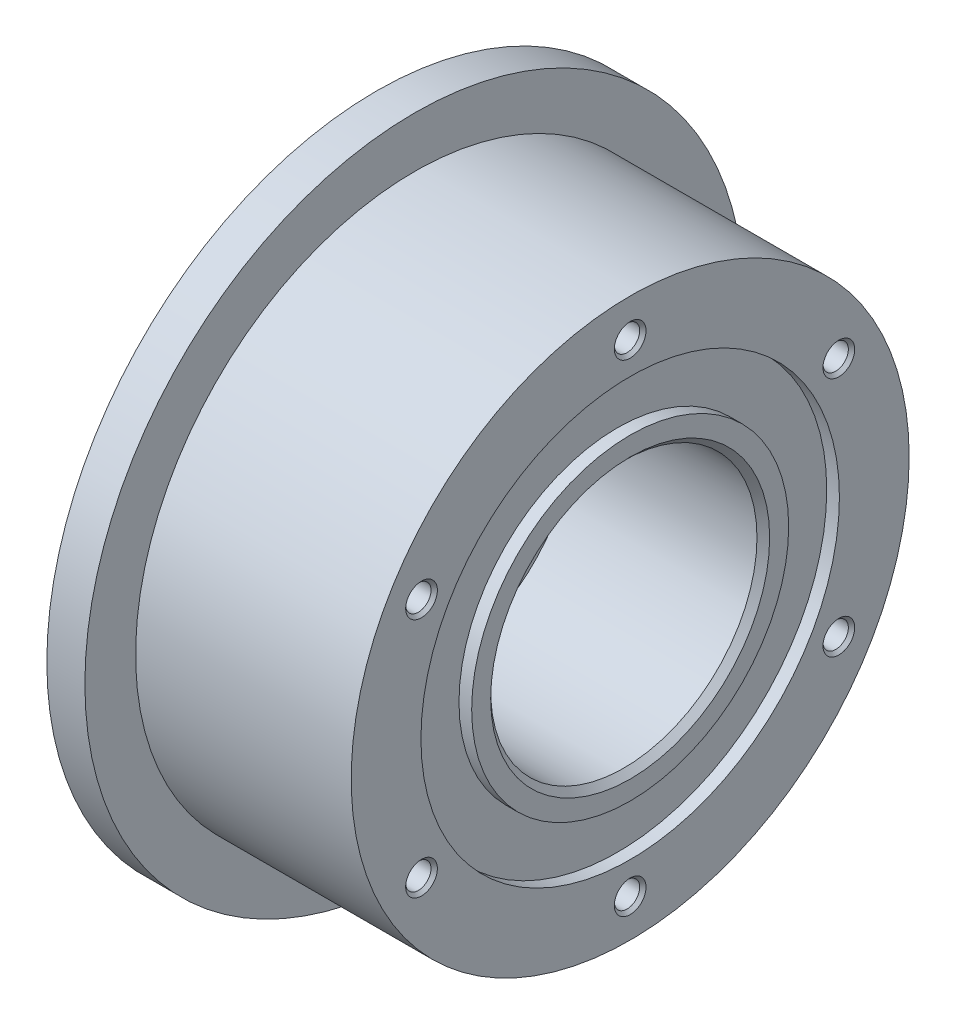
ISO-10303-21;
HEADER;
FILE_DESCRIPTION(('STEP AP214'),'2;1');
FILE_NAME('part.step','',(''),(''),'','','');
FILE_SCHEMA(('AUTOMOTIVE_DESIGN { 1 0 10303 214 1 1 1 1 }'));
ENDSEC;
DATA;
#1=APPLICATION_CONTEXT('core data for automotive mechanical design processes');
#2=APPLICATION_PROTOCOL_DEFINITION('international standard','automotive_design',2000,#1);
#3=PRODUCT_CONTEXT('',#1,'mechanical');
#4=PRODUCT('Part','Part','',(#3));
#5=PRODUCT_RELATED_PRODUCT_CATEGORY('part','',(#4));
#6=PRODUCT_DEFINITION_FORMATION('','',#4);
#7=PRODUCT_DEFINITION_CONTEXT('part definition',#1,'design');
#8=PRODUCT_DEFINITION('design','',#6,#7);
#9=PRODUCT_DEFINITION_SHAPE('','',#8);
#10=(LENGTH_UNIT() NAMED_UNIT(*) SI_UNIT(.MILLI.,.METRE.));
#11=(NAMED_UNIT(*) PLANE_ANGLE_UNIT() SI_UNIT($,.RADIAN.));
#12=(NAMED_UNIT(*) SI_UNIT($,.STERADIAN.) SOLID_ANGLE_UNIT());
#13=UNCERTAINTY_MEASURE_WITH_UNIT(LENGTH_MEASURE(1.E-05),#10,'distance_accuracy_value','');
#14=(GEOMETRIC_REPRESENTATION_CONTEXT(3) GLOBAL_UNCERTAINTY_ASSIGNED_CONTEXT((#13)) GLOBAL_UNIT_ASSIGNED_CONTEXT((#10,
#11,#12)) REPRESENTATION_CONTEXT('',''));
#15=CARTESIAN_POINT('',(0.,0.,0.));
#16=DIRECTION('',(0.,0.,1.));
#17=DIRECTION('',(1.,0.,0.));
#18=AXIS2_PLACEMENT_3D('',#15,#16,#17);
#19=CARTESIAN_POINT('',(-5.,0.,0.));
#20=DIRECTION('',(1.,0.,0.));
#21=DIRECTION('',(0.,0.,-1.));
#22=AXIS2_PLACEMENT_3D('',#19,#20,#21);
#23=CYLINDRICAL_SURFACE('',#22,31.);
#24=CARTESIAN_POINT('',(-2.,0.,0.));
#25=DIRECTION('',(1.,0.,0.));
#26=DIRECTION('',(0.,0.,-1.));
#27=AXIS2_PLACEMENT_3D('',#24,#25,#26);
#28=CIRCLE('',#27,31.);
#29=CARTESIAN_POINT('',(-2.,0.,-31.));
#30=VERTEX_POINT('',#29);
#31=EDGE_CURVE('E141',#30,#30,#28,.T.);
#32=ORIENTED_EDGE('',*,*,#31,.T.);
#33=EDGE_LOOP('',(#32));
#34=FACE_BOUND('',#33,.T.);
#35=CARTESIAN_POINT('',(15.5,0.,0.));
#36=DIRECTION('',(1.,0.,0.));
#37=DIRECTION('',(0.,0.,-1.));
#38=AXIS2_PLACEMENT_3D('',#35,#36,#37);
#39=CIRCLE('',#38,31.);
#40=CARTESIAN_POINT('',(15.5,0.,-31.));
#41=VERTEX_POINT('',#40);
#42=EDGE_CURVE('E120',#41,#41,#39,.T.);
#43=ORIENTED_EDGE('',*,*,#42,.F.);
#44=EDGE_LOOP('',(#43));
#45=FACE_BOUND('',#44,.T.);
#46=ADVANCED_FACE('F31',(#34,#45),#23,.T.);
#47=CARTESIAN_POINT('',(15.5,0.,0.));
#48=DIRECTION('',(1.,0.,0.));
#49=DIRECTION('',(0.,0.,-1.));
#50=AXIS2_PLACEMENT_3D('',#47,#48,#49);
#51=TOROIDAL_SURFACE('',#50,34.5,3.5);
#52=ORIENTED_EDGE('',*,*,#42,.T.);
#53=EDGE_LOOP('',(#52));
#54=FACE_BOUND('',#53,.T.);
#55=CARTESIAN_POINT('',(15.5,0.,0.));
#56=DIRECTION('',(1.,0.,0.));
#57=DIRECTION('',(0.,0.,-1.));
#58=AXIS2_PLACEMENT_3D('',#55,#56,#57);
#59=CIRCLE('',#58,38.);
#60=CARTESIAN_POINT('',(15.5,0.,-38.));
#61=VERTEX_POINT('',#60);
#62=EDGE_CURVE('E123',#61,#61,#59,.T.);
#63=ORIENTED_EDGE('',*,*,#62,.F.);
#64=EDGE_LOOP('',(#63));
#65=FACE_BOUND('',#64,.T.);
#66=ADVANCED_FACE('F222',(#54,#65),#51,.F.);
#67=CARTESIAN_POINT('',(-5.,0.,0.));
#68=DIRECTION('',(1.,0.,0.));
#69=DIRECTION('',(0.,0.,-1.));
#70=AXIS2_PLACEMENT_3D('',#67,#68,#69);
#71=CYLINDRICAL_SURFACE('',#70,38.);
#72=ORIENTED_EDGE('',*,*,#62,.T.);
#73=EDGE_LOOP('',(#72));
#74=FACE_BOUND('',#73,.T.);
#75=CARTESIAN_POINT('',(-5.,0.,0.));
#76=DIRECTION('',(1.,0.,0.));
#77=DIRECTION('',(0.,0.,-1.));
#78=AXIS2_PLACEMENT_3D('',#75,#76,#77);
#79=CIRCLE('',#78,38.);
#80=CARTESIAN_POINT('',(-5.,0.,-38.));
#81=VERTEX_POINT('',#80);
#82=EDGE_CURVE('E126',#81,#81,#79,.T.);
#83=ORIENTED_EDGE('',*,*,#82,.F.);
#84=EDGE_LOOP('',(#83));
#85=FACE_BOUND('',#84,.T.);
#86=ADVANCED_FACE('F228',(#74,#85),#71,.F.);
#87=CARTESIAN_POINT('',(-5.,52.,0.));
#88=DIRECTION('',(-1.,0.,0.));
#89=DIRECTION('',(0.,0.,1.));
#90=AXIS2_PLACEMENT_3D('',#87,#88,#89);
#91=PLANE('',#90);
#92=ORIENTED_EDGE('',*,*,#82,.T.);
#93=EDGE_LOOP('',(#92));
#94=FACE_BOUND('',#93,.T.);
#95=CARTESIAN_POINT('',(-5.,0.,0.));
#96=DIRECTION('',(1.,0.,0.));
#97=DIRECTION('',(0.,0.,-1.));
#98=AXIS2_PLACEMENT_3D('',#95,#96,#97);
#99=CIRCLE('',#98,52.);
#100=CARTESIAN_POINT('',(-5.,0.,-52.));
#101=VERTEX_POINT('',#100);
#102=EDGE_CURVE('E129',#101,#101,#99,.T.);
#103=ORIENTED_EDGE('',*,*,#102,.F.);
#104=EDGE_LOOP('',(#103));
#105=FACE_BOUND('',#104,.T.);
#106=ADVANCED_FACE('F307',(#94,#105),#91,.T.);
#107=CARTESIAN_POINT('',(-5.,0.,0.));
#108=DIRECTION('',(1.,0.,0.));
#109=DIRECTION('',(0.,0.,-1.));
#110=AXIS2_PLACEMENT_3D('',#107,#108,#109);
#111=CYLINDRICAL_SURFACE('',#110,52.);
#112=ORIENTED_EDGE('',*,*,#102,.T.);
#113=EDGE_LOOP('',(#112));
#114=FACE_BOUND('',#113,.T.);
#115=CARTESIAN_POINT('',(1.,0.,0.));
#116=DIRECTION('',(1.,0.,0.));
#117=DIRECTION('',(0.,0.,-1.));
#118=AXIS2_PLACEMENT_3D('',#115,#116,#117);
#119=CIRCLE('',#118,52.);
#120=CARTESIAN_POINT('',(1.,0.,-52.));
#121=VERTEX_POINT('',#120);
#122=EDGE_CURVE('E132',#121,#121,#119,.T.);
#123=ORIENTED_EDGE('',*,*,#122,.F.);
#124=EDGE_LOOP('',(#123));
#125=FACE_BOUND('',#124,.T.);
#126=ADVANCED_FACE('F300',(#114,#125),#111,.T.);
#127=CARTESIAN_POINT('',(1.,44.,0.));
#128=DIRECTION('',(1.,0.,0.));
#129=DIRECTION('',(0.,0.,-1.));
#130=AXIS2_PLACEMENT_3D('',#127,#128,#129);
#131=PLANE('',#130);
#132=ORIENTED_EDGE('',*,*,#122,.T.);
#133=EDGE_LOOP('',(#132));
#134=FACE_BOUND('',#133,.T.);
#135=CARTESIAN_POINT('',(1.,0.,0.));
#136=DIRECTION('',(1.,0.,0.));
#137=DIRECTION('',(0.,0.,-1.));
#138=AXIS2_PLACEMENT_3D('',#135,#136,#137);
#139=CIRCLE('',#138,44.);
#140=CARTESIAN_POINT('',(1.,0.,-44.));
#141=VERTEX_POINT('',#140);
#142=EDGE_CURVE('E135',#141,#141,#139,.T.);
#143=ORIENTED_EDGE('',*,*,#142,.F.);
#144=EDGE_LOOP('',(#143));
#145=FACE_BOUND('',#144,.T.);
#146=ADVANCED_FACE('F294',(#134,#145),#131,.T.);
#147=CARTESIAN_POINT('',(-5.,0.,0.));
#148=DIRECTION('',(1.,0.,0.));
#149=DIRECTION('',(0.,0.,-1.));
#150=AXIS2_PLACEMENT_3D('',#147,#148,#149);
#151=CYLINDRICAL_SURFACE('',#150,44.);
#152=ORIENTED_EDGE('',*,*,#142,.T.);
#153=EDGE_LOOP('',(#152));
#154=FACE_BOUND('',#153,.T.);
#155=CARTESIAN_POINT('',(35.,0.,0.));
#156=DIRECTION('',(1.,0.,0.));
#157=DIRECTION('',(0.,0.,-1.));
#158=AXIS2_PLACEMENT_3D('',#155,#156,#157);
#159=CIRCLE('',#158,44.);
#160=CARTESIAN_POINT('',(35.,0.,-44.));
#161=VERTEX_POINT('',#160);
#162=EDGE_CURVE('E138',#161,#161,#159,.T.);
#163=ORIENTED_EDGE('',*,*,#162,.F.);
#164=EDGE_LOOP('',(#163));
#165=FACE_BOUND('',#164,.T.);
#166=ADVANCED_FACE('F286',(#154,#165),#151,.T.);
#167=CARTESIAN_POINT('',(35.,0.,0.));
#168=DIRECTION('',(1.,0.,0.));
#169=DIRECTION('',(0.,0.,-1.));
#170=AXIS2_PLACEMENT_3D('',#167,#168,#169);
#171=PLANE('',#170);
#172=CARTESIAN_POINT('',(35.,-19.,32.9089653438087));
#173=DIRECTION('',(1.,0.,0.));
#174=DIRECTION('',(0.,0.,-1.));
#175=AXIS2_PLACEMENT_3D('',#172,#173,#174);
#176=CIRCLE('',#175,2.50000000004499);
#177=CARTESIAN_POINT('',(35.,-19.,30.4089653437637));
#178=VERTEX_POINT('',#177);
#179=EDGE_CURVE('E90',#178,#178,#176,.F.);
#180=ORIENTED_EDGE('',*,*,#179,.T.);
#181=EDGE_LOOP('',(#180));
#182=FACE_BOUND('',#181,.T.);
#183=CARTESIAN_POINT('',(35.,-38.,0.));
#184=DIRECTION('',(1.,0.,0.));
#185=DIRECTION('',(0.,0.,-1.));
#186=AXIS2_PLACEMENT_3D('',#183,#184,#185);
#187=CIRCLE('',#186,2.50000000004504);
#188=CARTESIAN_POINT('',(35.,-38.,-2.50000000004503));
#189=VERTEX_POINT('',#188);
#190=EDGE_CURVE('E93',#189,#189,#187,.F.);
#191=ORIENTED_EDGE('',*,*,#190,.T.);
#192=EDGE_LOOP('',(#191));
#193=FACE_BOUND('',#192,.T.);
#194=CARTESIAN_POINT('',(35.,19.,-32.9089653438087));
#195=DIRECTION('',(1.,0.,0.));
#196=DIRECTION('',(0.,0.,-1.));
#197=AXIS2_PLACEMENT_3D('',#194,#195,#196);
#198=CIRCLE('',#197,2.50000000004504);
#199=CARTESIAN_POINT('',(35.,19.,-35.4089653438537));
#200=VERTEX_POINT('',#199);
#201=EDGE_CURVE('E96',#200,#200,#198,.F.);
#202=ORIENTED_EDGE('',*,*,#201,.T.);
#203=EDGE_LOOP('',(#202));
#204=FACE_BOUND('',#203,.T.);
#205=CARTESIAN_POINT('',(35.,38.,0.));
#206=DIRECTION('',(1.,0.,0.));
#207=DIRECTION('',(0.,0.,-1.));
#208=AXIS2_PLACEMENT_3D('',#205,#206,#207);
#209=CIRCLE('',#208,2.50000000004504);
#210=CARTESIAN_POINT('',(35.,38.,-2.50000000004504));
#211=VERTEX_POINT('',#210);
#212=EDGE_CURVE('E99',#211,#211,#209,.F.);
#213=ORIENTED_EDGE('',*,*,#212,.T.);
#214=EDGE_LOOP('',(#213));
#215=FACE_BOUND('',#214,.T.);
#216=CARTESIAN_POINT('',(35.,-19.,-32.9089653438087));
#217=DIRECTION('',(1.,0.,0.));
#218=DIRECTION('',(0.,0.,-1.));
#219=AXIS2_PLACEMENT_3D('',#216,#217,#218);
#220=CIRCLE('',#219,2.50000000004504);
#221=CARTESIAN_POINT('',(35.,-19.,-35.4089653438537));
#222=VERTEX_POINT('',#221);
#223=EDGE_CURVE('E102',#222,#222,#220,.F.);
#224=ORIENTED_EDGE('',*,*,#223,.T.);
#225=EDGE_LOOP('',(#224));
#226=FACE_BOUND('',#225,.T.);
#227=CARTESIAN_POINT('',(35.,19.,32.9089653438087));
#228=DIRECTION('',(1.,0.,0.));
#229=DIRECTION('',(0.,0.,-1.));
#230=AXIS2_PLACEMENT_3D('',#227,#228,#229);
#231=CIRCLE('',#230,2.50000000004499);
#232=CARTESIAN_POINT('',(35.,19.,30.4089653437637));
#233=VERTEX_POINT('',#232);
#234=EDGE_CURVE('E105',#233,#233,#231,.F.);
#235=ORIENTED_EDGE('',*,*,#234,.T.);
#236=EDGE_LOOP('',(#235));
#237=FACE_BOUND('',#236,.T.);
#238=CARTESIAN_POINT('',(35.,0.,0.));
#239=DIRECTION('',(1.,0.,0.));
#240=DIRECTION('',(0.,0.,-1.));
#241=AXIS2_PLACEMENT_3D('',#238,#239,#240);
#242=CIRCLE('',#241,33.);
#243=CARTESIAN_POINT('',(35.,0.,-33.));
#244=VERTEX_POINT('',#243);
#245=EDGE_CURVE('E147',#244,#244,#242,.T.);
#246=ORIENTED_EDGE('',*,*,#245,.F.);
#247=EDGE_LOOP('',(#246));
#248=FACE_BOUND('',#247,.T.);
#249=ORIENTED_EDGE('',*,*,#162,.T.);
#250=EDGE_LOOP('',(#249));
#251=FACE_BOUND('',#250,.T.);
#252=ADVANCED_FACE('F282',(#182,#193,#204,#215,#226,#237,#248,#251),#171,.T.);
#253=CARTESIAN_POINT('',(-2.,31.,0.));
#254=DIRECTION('',(-1.,0.,0.));
#255=DIRECTION('',(0.,0.,1.));
#256=AXIS2_PLACEMENT_3D('',#253,#254,#255);
#257=PLANE('',#256);
#258=CARTESIAN_POINT('',(-2.,0.,0.));
#259=DIRECTION('',(1.,0.,0.));
#260=DIRECTION('',(0.,0.,-1.));
#261=AXIS2_PLACEMENT_3D('',#258,#259,#260);
#262=CIRCLE('',#261,29.);
#263=CARTESIAN_POINT('',(-2.,0.,-29.));
#264=VERTEX_POINT('',#263);
#265=EDGE_CURVE('E153',#264,#264,#262,.T.);
#266=ORIENTED_EDGE('',*,*,#265,.T.);
#267=EDGE_LOOP('',(#266));
#268=FACE_BOUND('',#267,.T.);
#269=ORIENTED_EDGE('',*,*,#31,.F.);
#270=EDGE_LOOP('',(#269));
#271=FACE_BOUND('',#270,.T.);
#272=ADVANCED_FACE('F285',(#268,#271),#257,.T.);
#273=CARTESIAN_POINT('',(33.0000000000001,0.,0.));
#274=DIRECTION('',(-1.,0.,0.));
#275=DIRECTION('',(0.,0.,1.));
#276=AXIS2_PLACEMENT_3D('',#273,#274,#275);
#277=PLANE('',#276);
#278=CARTESIAN_POINT('',(33.0000000000001,0.,0.));
#279=DIRECTION('',(-1.,0.,0.));
#280=DIRECTION('',(0.,0.,1.));
#281=AXIS2_PLACEMENT_3D('',#278,#279,#280);
#282=CIRCLE('',#281,25.);
#283=CARTESIAN_POINT('',(33.0000000000001,0.,25.));
#284=VERTEX_POINT('',#283);
#285=EDGE_CURVE('E117',#284,#284,#282,.F.);
#286=ORIENTED_EDGE('',*,*,#285,.F.);
#287=EDGE_LOOP('',(#286));
#288=FACE_BOUND('',#287,.T.);
#289=CARTESIAN_POINT('',(33.,0.,0.));
#290=DIRECTION('',(1.,0.,0.));
#291=DIRECTION('',(0.,0.,-1.));
#292=AXIS2_PLACEMENT_3D('',#289,#290,#291);
#293=CIRCLE('',#292,33.);
#294=CARTESIAN_POINT('',(33.,0.,-33.));
#295=VERTEX_POINT('',#294);
#296=EDGE_CURVE('E144',#295,#295,#293,.T.);
#297=ORIENTED_EDGE('',*,*,#296,.T.);
#298=EDGE_LOOP('',(#297));
#299=FACE_BOUND('',#298,.T.);
#300=ADVANCED_FACE('F355',(#288,#299),#277,.F.);
#301=CARTESIAN_POINT('',(35.,0.,0.));
#302=DIRECTION('',(1.,0.,0.));
#303=DIRECTION('',(0.,0.,-1.));
#304=AXIS2_PLACEMENT_3D('',#301,#302,#303);
#305=CYLINDRICAL_SURFACE('',#304,33.);
#306=ORIENTED_EDGE('',*,*,#296,.F.);
#307=EDGE_LOOP('',(#306));
#308=FACE_BOUND('',#307,.T.);
#309=ORIENTED_EDGE('',*,*,#245,.T.);
#310=EDGE_LOOP('',(#309));
#311=FACE_BOUND('',#310,.T.);
#312=ADVANCED_FACE('F349',(#308,#311),#305,.F.);
#313=CARTESIAN_POINT('',(35.0000000000001,0.,0.));
#314=DIRECTION('',(-1.,0.,0.));
#315=DIRECTION('',(0.,0.,1.));
#316=AXIS2_PLACEMENT_3D('',#313,#314,#315);
#317=CYLINDRICAL_SURFACE('',#316,25.);
#318=CARTESIAN_POINT('',(35.0000000000001,0.,0.));
#319=DIRECTION('',(1.,0.,0.));
#320=DIRECTION('',(0.,0.,-1.));
#321=AXIS2_PLACEMENT_3D('',#318,#319,#320);
#322=CIRCLE('',#321,25.);
#323=CARTESIAN_POINT('',(35.0000000000001,0.,-25.));
#324=VERTEX_POINT('',#323);
#325=EDGE_CURVE('E150',#324,#324,#322,.T.);
#326=ORIENTED_EDGE('',*,*,#325,.F.);
#327=EDGE_LOOP('',(#326));
#328=FACE_BOUND('',#327,.T.);
#329=ORIENTED_EDGE('',*,*,#285,.T.);
#330=EDGE_LOOP('',(#329));
#331=FACE_BOUND('',#330,.T.);
#332=ADVANCED_FACE('F354',(#328,#331),#317,.T.);
#333=CARTESIAN_POINT('',(35.0000000000001,0.,0.));
#334=DIRECTION('',(1.,0.,0.));
#335=DIRECTION('',(0.,0.,-1.));
#336=AXIS2_PLACEMENT_3D('',#333,#334,#335);
#337=PLANE('',#336);
#338=CARTESIAN_POINT('',(35.0000000000001,0.,0.));
#339=DIRECTION('',(1.,0.,0.));
#340=DIRECTION('',(0.,0.,-1.));
#341=AXIS2_PLACEMENT_3D('',#338,#339,#340);
#342=CIRCLE('',#341,22.);
#343=CARTESIAN_POINT('',(35.0000000000001,0.,-22.));
#344=VERTEX_POINT('',#343);
#345=EDGE_CURVE('E111',#344,#344,#342,.F.);
#346=ORIENTED_EDGE('',*,*,#345,.T.);
#347=EDGE_LOOP('',(#346));
#348=FACE_BOUND('',#347,.T.);
#349=ORIENTED_EDGE('',*,*,#325,.T.);
#350=EDGE_LOOP('',(#349));
#351=FACE_BOUND('',#350,.T.);
#352=ADVANCED_FACE('F376',(#348,#351),#337,.T.);
#353=CARTESIAN_POINT('',(-2.,0.,0.));
#354=DIRECTION('',(1.,0.,0.));
#355=DIRECTION('',(0.,0.,-1.));
#356=AXIS2_PLACEMENT_3D('',#353,#354,#355);
#357=CYLINDRICAL_SURFACE('',#356,29.);
#358=ORIENTED_EDGE('',*,*,#265,.F.);
#359=EDGE_LOOP('',(#358));
#360=FACE_BOUND('',#359,.T.);
#361=CARTESIAN_POINT('',(0.,0.,0.));
#362=DIRECTION('',(1.,0.,0.));
#363=DIRECTION('',(0.,0.,-1.));
#364=AXIS2_PLACEMENT_3D('',#361,#362,#363);
#365=CIRCLE('',#364,29.);
#366=CARTESIAN_POINT('',(0.,0.,-29.));
#367=VERTEX_POINT('',#366);
#368=EDGE_CURVE('E165',#367,#367,#365,.T.);
#369=ORIENTED_EDGE('',*,*,#368,.T.);
#370=EDGE_LOOP('',(#369));
#371=FACE_BOUND('',#370,.T.);
#372=ADVANCED_FACE('F390',(#360,#371),#357,.F.);
#373=CARTESIAN_POINT('',(-2.,0.,0.));
#374=DIRECTION('',(1.,0.,0.));
#375=DIRECTION('',(0.,0.,-1.));
#376=AXIS2_PLACEMENT_3D('',#373,#374,#375);
#377=CYLINDRICAL_SURFACE('',#376,21.);
#378=CARTESIAN_POINT('',(34.,0.,0.));
#379=DIRECTION('',(1.,0.,0.));
#380=DIRECTION('',(0.,0.,-1.));
#381=AXIS2_PLACEMENT_3D('',#378,#379,#380);
#382=CIRCLE('',#381,21.);
#383=CARTESIAN_POINT('',(34.,0.,-21.));
#384=VERTEX_POINT('',#383);
#385=EDGE_CURVE('E114',#384,#384,#382,.T.);
#386=ORIENTED_EDGE('',*,*,#385,.T.);
#387=EDGE_LOOP('',(#386));
#388=FACE_BOUND('',#387,.T.);
#389=CARTESIAN_POINT('',(5.,0.,0.));
#390=DIRECTION('',(1.,0.,0.));
#391=DIRECTION('',(0.,0.,-1.));
#392=AXIS2_PLACEMENT_3D('',#389,#390,#391);
#393=CIRCLE('',#392,21.);
#394=CARTESIAN_POINT('',(5.,0.,-21.));
#395=VERTEX_POINT('',#394);
#396=EDGE_CURVE('E156',#395,#395,#393,.T.);
#397=ORIENTED_EDGE('',*,*,#396,.F.);
#398=EDGE_LOOP('',(#397));
#399=FACE_BOUND('',#398,.T.);
#400=ADVANCED_FACE('F395',(#388,#399),#377,.F.);
#401=CARTESIAN_POINT('',(5.,21.,0.));
#402=DIRECTION('',(-1.,0.,0.));
#403=DIRECTION('',(0.,0.,1.));
#404=AXIS2_PLACEMENT_3D('',#401,#402,#403);
#405=PLANE('',#404);
#406=CARTESIAN_POINT('',(5.,0.,0.));
#407=DIRECTION('',(1.,0.,0.));
#408=DIRECTION('',(0.,0.,-1.));
#409=AXIS2_PLACEMENT_3D('',#406,#407,#408);
#410=CIRCLE('',#409,17.9999999999999);
#411=CARTESIAN_POINT('',(5.,0.,-17.9999999999999));
#412=VERTEX_POINT('',#411);
#413=EDGE_CURVE('E159',#412,#412,#410,.T.);
#414=ORIENTED_EDGE('',*,*,#413,.F.);
#415=EDGE_LOOP('',(#414));
#416=FACE_BOUND('',#415,.T.);
#417=ORIENTED_EDGE('',*,*,#396,.T.);
#418=EDGE_LOOP('',(#417));
#419=FACE_BOUND('',#418,.T.);
#420=ADVANCED_FACE('F403',(#416,#419),#405,.F.);
#421=CARTESIAN_POINT('',(-2.,0.,0.));
#422=DIRECTION('',(1.,0.,0.));
#423=DIRECTION('',(0.,0.,-1.));
#424=AXIS2_PLACEMENT_3D('',#421,#422,#423);
#425=CYLINDRICAL_SURFACE('',#424,17.9999999999999);
#426=CARTESIAN_POINT('',(0.,0.,0.));
#427=DIRECTION('',(1.,0.,0.));
#428=DIRECTION('',(0.,0.,-1.));
#429=AXIS2_PLACEMENT_3D('',#426,#427,#428);
#430=CIRCLE('',#429,17.9999999999999);
#431=CARTESIAN_POINT('',(0.,0.,-17.9999999999999));
#432=VERTEX_POINT('',#431);
#433=EDGE_CURVE('E162',#432,#432,#430,.T.);
#434=ORIENTED_EDGE('',*,*,#433,.F.);
#435=EDGE_LOOP('',(#434));
#436=FACE_BOUND('',#435,.T.);
#437=ORIENTED_EDGE('',*,*,#413,.T.);
#438=EDGE_LOOP('',(#437));
#439=FACE_BOUND('',#438,.T.);
#440=ADVANCED_FACE('F408',(#436,#439),#425,.F.);
#441=CARTESIAN_POINT('',(0.,17.9999999999999,0.));
#442=DIRECTION('',(1.,0.,0.));
#443=DIRECTION('',(0.,0.,-1.));
#444=AXIS2_PLACEMENT_3D('',#441,#442,#443);
#445=PLANE('',#444);
#446=CARTESIAN_POINT('',(0.,12.,-20.7846096908265));
#447=DIRECTION('',(1.,0.,0.));
#448=DIRECTION('',(0.,0.,-1.));
#449=AXIS2_PLACEMENT_3D('',#446,#447,#448);
#450=CIRCLE('',#449,2.50000000004504);
#451=CARTESIAN_POINT('',(0.,12.,-23.2846096908715));
#452=VERTEX_POINT('',#451);
#453=EDGE_CURVE('E63',#452,#452,#450,.T.);
#454=ORIENTED_EDGE('',*,*,#453,.T.);
#455=EDGE_LOOP('',(#454));
#456=FACE_BOUND('',#455,.T.);
#457=CARTESIAN_POINT('',(0.,12.,20.7846096908265));
#458=DIRECTION('',(1.,0.,0.));
#459=DIRECTION('',(0.,0.,-1.));
#460=AXIS2_PLACEMENT_3D('',#457,#458,#459);
#461=CIRCLE('',#460,2.50000000004504);
#462=CARTESIAN_POINT('',(0.,12.,18.2846096907815));
#463=VERTEX_POINT('',#462);
#464=EDGE_CURVE('E66',#463,#463,#461,.T.);
#465=ORIENTED_EDGE('',*,*,#464,.T.);
#466=EDGE_LOOP('',(#465));
#467=FACE_BOUND('',#466,.T.);
#468=CARTESIAN_POINT('',(0.,-24.,0.));
#469=DIRECTION('',(1.,0.,0.));
#470=DIRECTION('',(0.,0.,-1.));
#471=AXIS2_PLACEMENT_3D('',#468,#469,#470);
#472=CIRCLE('',#471,2.50000000004504);
#473=CARTESIAN_POINT('',(0.,-24.,-2.50000000004504));
#474=VERTEX_POINT('',#473);
#475=EDGE_CURVE('E69',#474,#474,#472,.T.);
#476=ORIENTED_EDGE('',*,*,#475,.T.);
#477=EDGE_LOOP('',(#476));
#478=FACE_BOUND('',#477,.T.);
#479=CARTESIAN_POINT('',(0.,-12.,20.7846096908265));
#480=DIRECTION('',(1.,0.,0.));
#481=DIRECTION('',(0.,0.,-1.));
#482=AXIS2_PLACEMENT_3D('',#479,#480,#481);
#483=CIRCLE('',#482,2.50000000004504);
#484=CARTESIAN_POINT('',(0.,-12.,18.2846096907815));
#485=VERTEX_POINT('',#484);
#486=EDGE_CURVE('E72',#485,#485,#483,.T.);
#487=ORIENTED_EDGE('',*,*,#486,.T.);
#488=EDGE_LOOP('',(#487));
#489=FACE_BOUND('',#488,.T.);
#490=CARTESIAN_POINT('',(0.,-12.,-20.7846096908265));
#491=DIRECTION('',(1.,0.,0.));
#492=DIRECTION('',(0.,0.,-1.));
#493=AXIS2_PLACEMENT_3D('',#490,#491,#492);
#494=CIRCLE('',#493,2.50000000004504);
#495=CARTESIAN_POINT('',(0.,-12.,-23.2846096908715));
#496=VERTEX_POINT('',#495);
#497=EDGE_CURVE('E75',#496,#496,#494,.T.);
#498=ORIENTED_EDGE('',*,*,#497,.T.);
#499=EDGE_LOOP('',(#498));
#500=FACE_BOUND('',#499,.T.);
#501=CARTESIAN_POINT('',(0.,24.,0.));
#502=DIRECTION('',(1.,0.,0.));
#503=DIRECTION('',(0.,0.,-1.));
#504=AXIS2_PLACEMENT_3D('',#501,#502,#503);
#505=CIRCLE('',#504,2.50000000004504);
#506=CARTESIAN_POINT('',(0.,24.,-2.50000000004503));
#507=VERTEX_POINT('',#506);
#508=EDGE_CURVE('E78',#507,#507,#505,.T.);
#509=ORIENTED_EDGE('',*,*,#508,.T.);
#510=EDGE_LOOP('',(#509));
#511=FACE_BOUND('',#510,.T.);
#512=ORIENTED_EDGE('',*,*,#368,.F.);
#513=EDGE_LOOP('',(#512));
#514=FACE_BOUND('',#513,.T.);
#515=ORIENTED_EDGE('',*,*,#433,.T.);
#516=EDGE_LOOP('',(#515));
#517=FACE_BOUND('',#516,.T.);
#518=ADVANCED_FACE('F418',(#456,#467,#478,#489,#500,#511,#514,#517),#445,.F.);
#519=CARTESIAN_POINT('',(25.,19.,32.9089653438087));
#520=DIRECTION('',(-1.,0.,0.));
#521=DIRECTION('',(0.,0.,1.));
#522=AXIS2_PLACEMENT_3D('',#519,#520,#521);
#523=PLANE('',#522);
#524=CARTESIAN_POINT('',(25.,19.,32.9089653438087));
#525=DIRECTION('',(1.,0.,0.));
#526=DIRECTION('',(0.,0.,-1.));
#527=AXIS2_PLACEMENT_3D('',#524,#525,#526);
#528=CIRCLE('',#527,1.99999999999999);
#529=CARTESIAN_POINT('',(25.,19.,30.9089653438087));
#530=VERTEX_POINT('',#529);
#531=EDGE_CURVE('E168',#530,#530,#528,.T.);
#532=ORIENTED_EDGE('',*,*,#531,.T.);
#533=EDGE_LOOP('',(#532));
#534=FACE_BOUND('',#533,.T.);
#535=ADVANCED_FACE('F426',(#534),#523,.F.);
#536=CARTESIAN_POINT('',(35.,19.,32.9089653438087));
#537=DIRECTION('',(1.,0.,0.));
#538=DIRECTION('',(0.,0.,-1.));
#539=AXIS2_PLACEMENT_3D('',#536,#537,#538);
#540=CYLINDRICAL_SURFACE('',#539,1.99999999999999);
#541=CARTESIAN_POINT('',(34.499999999955,19.,32.9089653438087));
#542=DIRECTION('',(1.,0.,0.));
#543=DIRECTION('',(0.,0.,-1.));
#544=AXIS2_PLACEMENT_3D('',#541,#542,#543);
#545=CIRCLE('',#544,1.99999999999999);
#546=CARTESIAN_POINT('',(34.499999999955,19.,30.9089653438087));
#547=VERTEX_POINT('',#546);
#548=EDGE_CURVE('E38',#547,#547,#545,.T.);
#549=ORIENTED_EDGE('',*,*,#548,.T.);
#550=EDGE_LOOP('',(#549));
#551=FACE_BOUND('',#550,.T.);
#552=ORIENTED_EDGE('',*,*,#531,.F.);
#553=EDGE_LOOP('',(#552));
#554=FACE_BOUND('',#553,.T.);
#555=ADVANCED_FACE('F431',(#551,#554),#540,.F.);
#556=CARTESIAN_POINT('',(25.,-38.,0.));
#557=DIRECTION('',(-1.,0.,0.));
#558=DIRECTION('',(0.,0.,1.));
#559=AXIS2_PLACEMENT_3D('',#556,#557,#558);
#560=PLANE('',#559);
#561=CARTESIAN_POINT('',(25.,-38.,0.));
#562=DIRECTION('',(1.,0.,0.));
#563=DIRECTION('',(0.,0.,-1.));
#564=AXIS2_PLACEMENT_3D('',#561,#562,#563);
#565=CIRCLE('',#564,1.99999999999999);
#566=CARTESIAN_POINT('',(25.,-38.,-1.99999999999999));
#567=VERTEX_POINT('',#566);
#568=EDGE_CURVE('E171',#567,#567,#565,.T.);
#569=ORIENTED_EDGE('',*,*,#568,.T.);
#570=EDGE_LOOP('',(#569));
#571=FACE_BOUND('',#570,.T.);
#572=ADVANCED_FACE('F439',(#571),#560,.F.);
#573=CARTESIAN_POINT('',(35.,-38.,0.));
#574=DIRECTION('',(1.,0.,0.));
#575=DIRECTION('',(0.,0.,-1.));
#576=AXIS2_PLACEMENT_3D('',#573,#574,#575);
#577=CYLINDRICAL_SURFACE('',#576,1.99999999999999);
#578=CARTESIAN_POINT('',(34.499999999955,-38.,0.));
#579=DIRECTION('',(1.,0.,0.));
#580=DIRECTION('',(0.,0.,-1.));
#581=AXIS2_PLACEMENT_3D('',#578,#579,#580);
#582=CIRCLE('',#581,1.99999999999999);
#583=CARTESIAN_POINT('',(34.499999999955,-38.,-1.99999999999999));
#584=VERTEX_POINT('',#583);
#585=EDGE_CURVE('E87',#584,#584,#582,.T.);
#586=ORIENTED_EDGE('',*,*,#585,.T.);
#587=EDGE_LOOP('',(#586));
#588=FACE_BOUND('',#587,.T.);
#589=ORIENTED_EDGE('',*,*,#568,.F.);
#590=EDGE_LOOP('',(#589));
#591=FACE_BOUND('',#590,.T.);
#592=ADVANCED_FACE('F444',(#588,#591),#577,.F.);
#593=CARTESIAN_POINT('',(25.,-19.,-32.9089653438087));
#594=DIRECTION('',(-1.,0.,0.));
#595=DIRECTION('',(0.,0.,1.));
#596=AXIS2_PLACEMENT_3D('',#593,#594,#595);
#597=PLANE('',#596);
#598=CARTESIAN_POINT('',(25.,-19.,-32.9089653438087));
#599=DIRECTION('',(1.,0.,0.));
#600=DIRECTION('',(0.,0.,-1.));
#601=AXIS2_PLACEMENT_3D('',#598,#599,#600);
#602=CIRCLE('',#601,1.99999999999999);
#603=CARTESIAN_POINT('',(25.,-19.,-34.9089653438087));
#604=VERTEX_POINT('',#603);
#605=EDGE_CURVE('E174',#604,#604,#602,.T.);
#606=ORIENTED_EDGE('',*,*,#605,.T.);
#607=EDGE_LOOP('',(#606));
#608=FACE_BOUND('',#607,.T.);
#609=ADVANCED_FACE('F452',(#608),#597,.F.);
#610=CARTESIAN_POINT('',(35.,-19.,-32.9089653438087));
#611=DIRECTION('',(1.,0.,0.));
#612=DIRECTION('',(0.,0.,-1.));
#613=AXIS2_PLACEMENT_3D('',#610,#611,#612);
#614=CYLINDRICAL_SURFACE('',#613,1.99999999999999);
#615=CARTESIAN_POINT('',(34.499999999955,-19.,-32.9089653438087));
#616=DIRECTION('',(1.,0.,0.));
#617=DIRECTION('',(0.,0.,-1.));
#618=AXIS2_PLACEMENT_3D('',#615,#616,#617);
#619=CIRCLE('',#618,1.99999999999999);
#620=CARTESIAN_POINT('',(34.499999999955,-19.,-34.9089653438087));
#621=VERTEX_POINT('',#620);
#622=EDGE_CURVE('E46',#621,#621,#619,.T.);
#623=ORIENTED_EDGE('',*,*,#622,.T.);
#624=EDGE_LOOP('',(#623));
#625=FACE_BOUND('',#624,.T.);
#626=ORIENTED_EDGE('',*,*,#605,.F.);
#627=EDGE_LOOP('',(#626));
#628=FACE_BOUND('',#627,.T.);
#629=ADVANCED_FACE('F457',(#625,#628),#614,.F.);
#630=CARTESIAN_POINT('',(25.,19.,-32.9089653438087));
#631=DIRECTION('',(-1.,0.,0.));
#632=DIRECTION('',(0.,0.,1.));
#633=AXIS2_PLACEMENT_3D('',#630,#631,#632);
#634=PLANE('',#633);
#635=CARTESIAN_POINT('',(25.,19.,-32.9089653438087));
#636=DIRECTION('',(1.,0.,0.));
#637=DIRECTION('',(0.,0.,-1.));
#638=AXIS2_PLACEMENT_3D('',#635,#636,#637);
#639=CIRCLE('',#638,1.99999999999999);
#640=CARTESIAN_POINT('',(25.,19.,-34.9089653438087));
#641=VERTEX_POINT('',#640);
#642=EDGE_CURVE('E177',#641,#641,#639,.T.);
#643=ORIENTED_EDGE('',*,*,#642,.T.);
#644=EDGE_LOOP('',(#643));
#645=FACE_BOUND('',#644,.T.);
#646=ADVANCED_FACE('F465',(#645),#634,.F.);
#647=CARTESIAN_POINT('',(35.,19.,-32.9089653438087));
#648=DIRECTION('',(1.,0.,0.));
#649=DIRECTION('',(0.,0.,-1.));
#650=AXIS2_PLACEMENT_3D('',#647,#648,#649);
#651=CYLINDRICAL_SURFACE('',#650,1.99999999999999);
#652=CARTESIAN_POINT('',(34.499999999955,19.,-32.9089653438087));
#653=DIRECTION('',(1.,0.,0.));
#654=DIRECTION('',(0.,0.,-1.));
#655=AXIS2_PLACEMENT_3D('',#652,#653,#654);
#656=CIRCLE('',#655,1.99999999999999);
#657=CARTESIAN_POINT('',(34.499999999955,19.,-34.9089653438087));
#658=VERTEX_POINT('',#657);
#659=EDGE_CURVE('E84',#658,#658,#656,.T.);
#660=ORIENTED_EDGE('',*,*,#659,.T.);
#661=EDGE_LOOP('',(#660));
#662=FACE_BOUND('',#661,.T.);
#663=ORIENTED_EDGE('',*,*,#642,.F.);
#664=EDGE_LOOP('',(#663));
#665=FACE_BOUND('',#664,.T.);
#666=ADVANCED_FACE('F470',(#662,#665),#651,.F.);
#667=CARTESIAN_POINT('',(25.,38.,0.));
#668=DIRECTION('',(-1.,0.,0.));
#669=DIRECTION('',(0.,0.,1.));
#670=AXIS2_PLACEMENT_3D('',#667,#668,#669);
#671=PLANE('',#670);
#672=CARTESIAN_POINT('',(25.,38.,0.));
#673=DIRECTION('',(1.,0.,0.));
#674=DIRECTION('',(0.,0.,-1.));
#675=AXIS2_PLACEMENT_3D('',#672,#673,#674);
#676=CIRCLE('',#675,1.99999999999999);
#677=CARTESIAN_POINT('',(25.,38.,-1.99999999999999));
#678=VERTEX_POINT('',#677);
#679=EDGE_CURVE('E180',#678,#678,#676,.T.);
#680=ORIENTED_EDGE('',*,*,#679,.T.);
#681=EDGE_LOOP('',(#680));
#682=FACE_BOUND('',#681,.T.);
#683=ADVANCED_FACE('F478',(#682),#671,.F.);
#684=CARTESIAN_POINT('',(35.,38.,0.));
#685=DIRECTION('',(1.,0.,0.));
#686=DIRECTION('',(0.,0.,-1.));
#687=AXIS2_PLACEMENT_3D('',#684,#685,#686);
#688=CYLINDRICAL_SURFACE('',#687,1.99999999999999);
#689=CARTESIAN_POINT('',(34.499999999955,38.,0.));
#690=DIRECTION('',(1.,0.,0.));
#691=DIRECTION('',(0.,0.,-1.));
#692=AXIS2_PLACEMENT_3D('',#689,#690,#691);
#693=CIRCLE('',#692,1.99999999999999);
#694=CARTESIAN_POINT('',(34.499999999955,38.,-2.));
#695=VERTEX_POINT('',#694);
#696=EDGE_CURVE('E54',#695,#695,#693,.T.);
#697=ORIENTED_EDGE('',*,*,#696,.T.);
#698=EDGE_LOOP('',(#697));
#699=FACE_BOUND('',#698,.T.);
#700=ORIENTED_EDGE('',*,*,#679,.F.);
#701=EDGE_LOOP('',(#700));
#702=FACE_BOUND('',#701,.T.);
#703=ADVANCED_FACE('F483',(#699,#702),#688,.F.);
#704=CARTESIAN_POINT('',(25.,-19.,32.9089653438087));
#705=DIRECTION('',(-1.,0.,0.));
#706=DIRECTION('',(0.,0.,1.));
#707=AXIS2_PLACEMENT_3D('',#704,#705,#706);
#708=PLANE('',#707);
#709=CARTESIAN_POINT('',(25.,-19.,32.9089653438087));
#710=DIRECTION('',(1.,0.,0.));
#711=DIRECTION('',(0.,0.,-1.));
#712=AXIS2_PLACEMENT_3D('',#709,#710,#711);
#713=CIRCLE('',#712,1.99999999999999);
#714=CARTESIAN_POINT('',(25.,-19.,30.9089653438087));
#715=VERTEX_POINT('',#714);
#716=EDGE_CURVE('E183',#715,#715,#713,.T.);
#717=ORIENTED_EDGE('',*,*,#716,.T.);
#718=EDGE_LOOP('',(#717));
#719=FACE_BOUND('',#718,.T.);
#720=ADVANCED_FACE('F491',(#719),#708,.F.);
#721=CARTESIAN_POINT('',(35.,-19.,32.9089653438087));
#722=DIRECTION('',(1.,0.,0.));
#723=DIRECTION('',(0.,0.,-1.));
#724=AXIS2_PLACEMENT_3D('',#721,#722,#723);
#725=CYLINDRICAL_SURFACE('',#724,1.99999999999999);
#726=CARTESIAN_POINT('',(34.499999999955,-19.,32.9089653438087));
#727=DIRECTION('',(1.,0.,0.));
#728=DIRECTION('',(0.,0.,-1.));
#729=AXIS2_PLACEMENT_3D('',#726,#727,#728);
#730=CIRCLE('',#729,1.99999999999999);
#731=CARTESIAN_POINT('',(34.499999999955,-19.,30.9089653438087));
#732=VERTEX_POINT('',#731);
#733=EDGE_CURVE('E108',#732,#732,#730,.T.);
#734=ORIENTED_EDGE('',*,*,#733,.T.);
#735=EDGE_LOOP('',(#734));
#736=FACE_BOUND('',#735,.T.);
#737=ORIENTED_EDGE('',*,*,#716,.F.);
#738=EDGE_LOOP('',(#737));
#739=FACE_BOUND('',#738,.T.);
#740=ADVANCED_FACE('F496',(#736,#739),#725,.F.);
#741=CARTESIAN_POINT('',(9.99999999999999,24.,0.));
#742=DIRECTION('',(1.,0.,0.));
#743=DIRECTION('',(0.,0.,-1.));
#744=AXIS2_PLACEMENT_3D('',#741,#742,#743);
#745=PLANE('',#744);
#746=CARTESIAN_POINT('',(9.99999999999999,24.,0.));
#747=DIRECTION('',(-1.,0.,0.));
#748=DIRECTION('',(0.,0.,1.));
#749=AXIS2_PLACEMENT_3D('',#746,#747,#748);
#750=CIRCLE('',#749,1.99999999999999);
#751=CARTESIAN_POINT('',(9.99999999999999,24.,1.99999999999999));
#752=VERTEX_POINT('',#751);
#753=EDGE_CURVE('E186',#752,#752,#750,.T.);
#754=ORIENTED_EDGE('',*,*,#753,.T.);
#755=EDGE_LOOP('',(#754));
#756=FACE_BOUND('',#755,.T.);
#757=ADVANCED_FACE('F504',(#756),#745,.F.);
#758=CARTESIAN_POINT('',(0.,24.,0.));
#759=DIRECTION('',(-1.,0.,0.));
#760=DIRECTION('',(0.,0.,1.));
#761=AXIS2_PLACEMENT_3D('',#758,#759,#760);
#762=CYLINDRICAL_SURFACE('',#761,1.99999999999999);
#763=CARTESIAN_POINT('',(0.500000000045047,24.,0.));
#764=DIRECTION('',(1.,0.,0.));
#765=DIRECTION('',(0.,0.,-1.));
#766=AXIS2_PLACEMENT_3D('',#763,#764,#765);
#767=CIRCLE('',#766,1.99999999999999);
#768=CARTESIAN_POINT('',(0.500000000045047,24.,-1.99999999999998));
#769=VERTEX_POINT('',#768);
#770=EDGE_CURVE('E10',#769,#769,#767,.F.);
#771=ORIENTED_EDGE('',*,*,#770,.T.);
#772=EDGE_LOOP('',(#771));
#773=FACE_BOUND('',#772,.T.);
#774=ORIENTED_EDGE('',*,*,#753,.F.);
#775=EDGE_LOOP('',(#774));
#776=FACE_BOUND('',#775,.T.);
#777=ADVANCED_FACE('F509',(#773,#776),#762,.F.);
#778=CARTESIAN_POINT('',(9.99999999999999,-12.,-20.7846096908265));
#779=DIRECTION('',(1.,0.,0.));
#780=DIRECTION('',(0.,0.,-1.));
#781=AXIS2_PLACEMENT_3D('',#778,#779,#780);
#782=PLANE('',#781);
#783=CARTESIAN_POINT('',(9.99999999999999,-12.,-20.7846096908265));
#784=DIRECTION('',(-1.,0.,0.));
#785=DIRECTION('',(0.,0.,1.));
#786=AXIS2_PLACEMENT_3D('',#783,#784,#785);
#787=CIRCLE('',#786,1.99999999999999);
#788=CARTESIAN_POINT('',(9.99999999999999,-12.,-18.7846096908265));
#789=VERTEX_POINT('',#788);
#790=EDGE_CURVE('E189',#789,#789,#787,.T.);
#791=ORIENTED_EDGE('',*,*,#790,.T.);
#792=EDGE_LOOP('',(#791));
#793=FACE_BOUND('',#792,.T.);
#794=ADVANCED_FACE('F517',(#793),#782,.F.);
#795=CARTESIAN_POINT('',(0.,-12.,-20.7846096908265));
#796=DIRECTION('',(-1.,0.,0.));
#797=DIRECTION('',(0.,0.,1.));
#798=AXIS2_PLACEMENT_3D('',#795,#796,#797);
#799=CYLINDRICAL_SURFACE('',#798,1.99999999999999);
#800=CARTESIAN_POINT('',(0.500000000045048,-12.,-20.7846096908265));
#801=DIRECTION('',(1.,0.,0.));
#802=DIRECTION('',(0.,0.,-1.));
#803=AXIS2_PLACEMENT_3D('',#800,#801,#802);
#804=CIRCLE('',#803,1.99999999999999);
#805=CARTESIAN_POINT('',(0.500000000045048,-12.,-22.7846096908265));
#806=VERTEX_POINT('',#805);
#807=EDGE_CURVE('E42',#806,#806,#804,.F.);
#808=ORIENTED_EDGE('',*,*,#807,.T.);
#809=EDGE_LOOP('',(#808));
#810=FACE_BOUND('',#809,.T.);
#811=ORIENTED_EDGE('',*,*,#790,.F.);
#812=EDGE_LOOP('',(#811));
#813=FACE_BOUND('',#812,.T.);
#814=ADVANCED_FACE('F522',(#810,#813),#799,.F.);
#815=CARTESIAN_POINT('',(9.99999999999999,-12.,20.7846096908265));
#816=DIRECTION('',(1.,0.,0.));
#817=DIRECTION('',(0.,0.,-1.));
#818=AXIS2_PLACEMENT_3D('',#815,#816,#817);
#819=PLANE('',#818);
#820=CARTESIAN_POINT('',(9.99999999999999,-12.,20.7846096908265));
#821=DIRECTION('',(-1.,0.,0.));
#822=DIRECTION('',(0.,0.,1.));
#823=AXIS2_PLACEMENT_3D('',#820,#821,#822);
#824=CIRCLE('',#823,1.99999999999999);
#825=CARTESIAN_POINT('',(9.99999999999999,-12.,22.7846096908265));
#826=VERTEX_POINT('',#825);
#827=EDGE_CURVE('E192',#826,#826,#824,.T.);
#828=ORIENTED_EDGE('',*,*,#827,.T.);
#829=EDGE_LOOP('',(#828));
#830=FACE_BOUND('',#829,.T.);
#831=ADVANCED_FACE('F530',(#830),#819,.F.);
#832=CARTESIAN_POINT('',(0.,-12.,20.7846096908265));
#833=DIRECTION('',(-1.,0.,0.));
#834=DIRECTION('',(0.,0.,1.));
#835=AXIS2_PLACEMENT_3D('',#832,#833,#834);
#836=CYLINDRICAL_SURFACE('',#835,1.99999999999999);
#837=CARTESIAN_POINT('',(0.500000000045048,-12.,20.7846096908265));
#838=DIRECTION('',(1.,0.,0.));
#839=DIRECTION('',(0.,0.,-1.));
#840=AXIS2_PLACEMENT_3D('',#837,#838,#839);
#841=CIRCLE('',#840,1.99999999999999);
#842=CARTESIAN_POINT('',(0.500000000045048,-12.,18.7846096908265));
#843=VERTEX_POINT('',#842);
#844=EDGE_CURVE('E51',#843,#843,#841,.F.);
#845=ORIENTED_EDGE('',*,*,#844,.T.);
#846=EDGE_LOOP('',(#845));
#847=FACE_BOUND('',#846,.T.);
#848=ORIENTED_EDGE('',*,*,#827,.F.);
#849=EDGE_LOOP('',(#848));
#850=FACE_BOUND('',#849,.T.);
#851=ADVANCED_FACE('F535',(#847,#850),#836,.F.);
#852=CARTESIAN_POINT('',(9.99999999999999,-24.,0.));
#853=DIRECTION('',(1.,0.,0.));
#854=DIRECTION('',(0.,0.,-1.));
#855=AXIS2_PLACEMENT_3D('',#852,#853,#854);
#856=PLANE('',#855);
#857=CARTESIAN_POINT('',(9.99999999999999,-24.,0.));
#858=DIRECTION('',(-1.,0.,0.));
#859=DIRECTION('',(0.,0.,1.));
#860=AXIS2_PLACEMENT_3D('',#857,#858,#859);
#861=CIRCLE('',#860,1.99999999999999);
#862=CARTESIAN_POINT('',(9.99999999999999,-24.,1.99999999999999));
#863=VERTEX_POINT('',#862);
#864=EDGE_CURVE('E195',#863,#863,#861,.T.);
#865=ORIENTED_EDGE('',*,*,#864,.T.);
#866=EDGE_LOOP('',(#865));
#867=FACE_BOUND('',#866,.T.);
#868=ADVANCED_FACE('F543',(#867),#856,.F.);
#869=CARTESIAN_POINT('',(0.,-24.,0.));
#870=DIRECTION('',(-1.,0.,0.));
#871=DIRECTION('',(0.,0.,1.));
#872=AXIS2_PLACEMENT_3D('',#869,#870,#871);
#873=CYLINDRICAL_SURFACE('',#872,1.99999999999999);
#874=CARTESIAN_POINT('',(0.500000000045047,-24.,0.));
#875=DIRECTION('',(1.,0.,0.));
#876=DIRECTION('',(0.,0.,-1.));
#877=AXIS2_PLACEMENT_3D('',#874,#875,#876);
#878=CIRCLE('',#877,1.99999999999999);
#879=CARTESIAN_POINT('',(0.500000000045047,-24.,-1.99999999999999));
#880=VERTEX_POINT('',#879);
#881=EDGE_CURVE('E57',#880,#880,#878,.F.);
#882=ORIENTED_EDGE('',*,*,#881,.T.);
#883=EDGE_LOOP('',(#882));
#884=FACE_BOUND('',#883,.T.);
#885=ORIENTED_EDGE('',*,*,#864,.F.);
#886=EDGE_LOOP('',(#885));
#887=FACE_BOUND('',#886,.T.);
#888=ADVANCED_FACE('F548',(#884,#887),#873,.F.);
#889=CARTESIAN_POINT('',(9.99999999999999,12.,-20.7846096908265));
#890=DIRECTION('',(1.,0.,0.));
#891=DIRECTION('',(0.,0.,-1.));
#892=AXIS2_PLACEMENT_3D('',#889,#890,#891);
#893=PLANE('',#892);
#894=CARTESIAN_POINT('',(9.99999999999999,12.,-20.7846096908265));
#895=DIRECTION('',(-1.,0.,0.));
#896=DIRECTION('',(0.,0.,1.));
#897=AXIS2_PLACEMENT_3D('',#894,#895,#896);
#898=CIRCLE('',#897,1.99999999999999);
#899=CARTESIAN_POINT('',(9.99999999999999,12.,-18.7846096908265));
#900=VERTEX_POINT('',#899);
#901=EDGE_CURVE('E198',#900,#900,#898,.T.);
#902=ORIENTED_EDGE('',*,*,#901,.T.);
#903=EDGE_LOOP('',(#902));
#904=FACE_BOUND('',#903,.T.);
#905=ADVANCED_FACE('F556',(#904),#893,.F.);
#906=CARTESIAN_POINT('',(0.,12.,-20.7846096908265));
#907=DIRECTION('',(-1.,0.,0.));
#908=DIRECTION('',(0.,0.,1.));
#909=AXIS2_PLACEMENT_3D('',#906,#907,#908);
#910=CYLINDRICAL_SURFACE('',#909,1.99999999999999);
#911=CARTESIAN_POINT('',(0.500000000045048,12.,-20.7846096908265));
#912=DIRECTION('',(1.,0.,0.));
#913=DIRECTION('',(0.,0.,-1.));
#914=AXIS2_PLACEMENT_3D('',#911,#912,#913);
#915=CIRCLE('',#914,1.99999999999999);
#916=CARTESIAN_POINT('',(0.500000000045048,12.,-22.7846096908265));
#917=VERTEX_POINT('',#916);
#918=EDGE_CURVE('E81',#917,#917,#915,.F.);
#919=ORIENTED_EDGE('',*,*,#918,.T.);
#920=EDGE_LOOP('',(#919));
#921=FACE_BOUND('',#920,.T.);
#922=ORIENTED_EDGE('',*,*,#901,.F.);
#923=EDGE_LOOP('',(#922));
#924=FACE_BOUND('',#923,.T.);
#925=ADVANCED_FACE('F219',(#921,#924),#910,.F.);
#926=CARTESIAN_POINT('',(9.99999999999999,12.,20.7846096908265));
#927=DIRECTION('',(1.,0.,0.));
#928=DIRECTION('',(0.,0.,-1.));
#929=AXIS2_PLACEMENT_3D('',#926,#927,#928);
#930=PLANE('',#929);
#931=CARTESIAN_POINT('',(9.99999999999999,12.,20.7846096908265));
#932=DIRECTION('',(-1.,0.,0.));
#933=DIRECTION('',(0.,0.,1.));
#934=AXIS2_PLACEMENT_3D('',#931,#932,#933);
#935=CIRCLE('',#934,1.99999999999999);
#936=CARTESIAN_POINT('',(9.99999999999999,12.,22.7846096908265));
#937=VERTEX_POINT('',#936);
#938=EDGE_CURVE('E201',#937,#937,#935,.T.);
#939=ORIENTED_EDGE('',*,*,#938,.T.);
#940=EDGE_LOOP('',(#939));
#941=FACE_BOUND('',#940,.T.);
#942=ADVANCED_FACE('F205',(#941),#930,.F.);
#943=CARTESIAN_POINT('',(0.,12.,20.7846096908265));
#944=DIRECTION('',(-1.,0.,0.));
#945=DIRECTION('',(0.,0.,1.));
#946=AXIS2_PLACEMENT_3D('',#943,#944,#945);
#947=CYLINDRICAL_SURFACE('',#946,1.99999999999999);
#948=CARTESIAN_POINT('',(0.500000000045048,12.,20.7846096908265));
#949=DIRECTION('',(1.,0.,0.));
#950=DIRECTION('',(0.,0.,-1.));
#951=AXIS2_PLACEMENT_3D('',#948,#949,#950);
#952=CIRCLE('',#951,1.99999999999999);
#953=CARTESIAN_POINT('',(0.500000000045048,12.,18.7846096908265));
#954=VERTEX_POINT('',#953);
#955=EDGE_CURVE('E60',#954,#954,#952,.F.);
#956=ORIENTED_EDGE('',*,*,#955,.T.);
#957=EDGE_LOOP('',(#956));
#958=FACE_BOUND('',#957,.T.);
#959=ORIENTED_EDGE('',*,*,#938,.F.);
#960=EDGE_LOOP('',(#959));
#961=FACE_BOUND('',#960,.T.);
#962=ADVANCED_FACE('F207',(#958,#961),#947,.F.);
#963=CARTESIAN_POINT('',(34.,0.,0.));
#964=DIRECTION('',(1.,0.,0.));
#965=DIRECTION('',(0.,0.,-1.));
#966=AXIS2_PLACEMENT_3D('',#963,#964,#965);
#967=CONICAL_SURFACE('',#966,21.,0.785398163397436);
#968=ORIENTED_EDGE('',*,*,#345,.F.);
#969=EDGE_LOOP('',(#968));
#970=FACE_BOUND('',#969,.T.);
#971=ORIENTED_EDGE('',*,*,#385,.F.);
#972=EDGE_LOOP('',(#971));
#973=FACE_BOUND('',#972,.T.);
#974=ADVANCED_FACE('F209',(#970,#973),#967,.F.);
#975=CARTESIAN_POINT('',(34.499999999955,-19.,32.9089653438087));
#976=DIRECTION('',(1.,0.,0.));
#977=DIRECTION('',(0.,0.,-1.));
#978=AXIS2_PLACEMENT_3D('',#975,#976,#977);
#979=CONICAL_SURFACE('',#978,1.99999999999999,0.785398163397452);
#980=ORIENTED_EDGE('',*,*,#179,.F.);
#981=EDGE_LOOP('',(#980));
#982=FACE_BOUND('',#981,.T.);
#983=ORIENTED_EDGE('',*,*,#733,.F.);
#984=EDGE_LOOP('',(#983));
#985=FACE_BOUND('',#984,.T.);
#986=ADVANCED_FACE('F216',(#982,#985),#979,.F.);
#987=CARTESIAN_POINT('',(34.499999999955,-38.,0.));
#988=DIRECTION('',(1.,0.,0.));
#989=DIRECTION('',(0.,0.,-1.));
#990=AXIS2_PLACEMENT_3D('',#987,#988,#989);
#991=CONICAL_SURFACE('',#990,1.99999999999999,0.785398163397452);
#992=ORIENTED_EDGE('',*,*,#190,.F.);
#993=EDGE_LOOP('',(#992));
#994=FACE_BOUND('',#993,.T.);
#995=ORIENTED_EDGE('',*,*,#585,.F.);
#996=EDGE_LOOP('',(#995));
#997=FACE_BOUND('',#996,.T.);
#998=ADVANCED_FACE('F236',(#994,#997),#991,.F.);
#999=CARTESIAN_POINT('',(34.499999999955,19.,-32.9089653438087));
#1000=DIRECTION('',(1.,0.,0.));
#1001=DIRECTION('',(0.,0.,-1.));
#1002=AXIS2_PLACEMENT_3D('',#999,#1000,#1001);
#1003=CONICAL_SURFACE('',#1002,1.99999999999999,0.785398163397452);
#1004=ORIENTED_EDGE('',*,*,#201,.F.);
#1005=EDGE_LOOP('',(#1004));
#1006=FACE_BOUND('',#1005,.T.);
#1007=ORIENTED_EDGE('',*,*,#659,.F.);
#1008=EDGE_LOOP('',(#1007));
#1009=FACE_BOUND('',#1008,.T.);
#1010=ADVANCED_FACE('F240',(#1006,#1009),#1003,.F.);
#1011=CARTESIAN_POINT('',(0.500000000045048,12.,-20.7846096908265));
#1012=DIRECTION('',(-1.,0.,0.));
#1013=DIRECTION('',(0.,0.,1.));
#1014=AXIS2_PLACEMENT_3D('',#1011,#1012,#1013);
#1015=CONICAL_SURFACE('',#1014,1.99999999999999,0.785398163397449);
#1016=ORIENTED_EDGE('',*,*,#453,.F.);
#1017=EDGE_LOOP('',(#1016));
#1018=FACE_BOUND('',#1017,.T.);
#1019=ORIENTED_EDGE('',*,*,#918,.F.);
#1020=EDGE_LOOP('',(#1019));
#1021=FACE_BOUND('',#1020,.T.);
#1022=ADVANCED_FACE('F244',(#1018,#1021),#1015,.F.);
#1023=CARTESIAN_POINT('',(0.500000000045048,12.,20.7846096908265));
#1024=DIRECTION('',(-1.,0.,0.));
#1025=DIRECTION('',(0.,0.,1.));
#1026=AXIS2_PLACEMENT_3D('',#1023,#1024,#1025);
#1027=CONICAL_SURFACE('',#1026,1.99999999999999,0.785398163397449);
#1028=ORIENTED_EDGE('',*,*,#464,.F.);
#1029=EDGE_LOOP('',(#1028));
#1030=FACE_BOUND('',#1029,.T.);
#1031=ORIENTED_EDGE('',*,*,#955,.F.);
#1032=EDGE_LOOP('',(#1031));
#1033=FACE_BOUND('',#1032,.T.);
#1034=ADVANCED_FACE('F248',(#1030,#1033),#1027,.F.);
#1035=CARTESIAN_POINT('',(0.500000000045047,-24.,0.));
#1036=DIRECTION('',(-1.,0.,0.));
#1037=DIRECTION('',(0.,0.,1.));
#1038=AXIS2_PLACEMENT_3D('',#1035,#1036,#1037);
#1039=CONICAL_SURFACE('',#1038,1.99999999999999,0.785398163397449);
#1040=ORIENTED_EDGE('',*,*,#475,.F.);
#1041=EDGE_LOOP('',(#1040));
#1042=FACE_BOUND('',#1041,.T.);
#1043=ORIENTED_EDGE('',*,*,#881,.F.);
#1044=EDGE_LOOP('',(#1043));
#1045=FACE_BOUND('',#1044,.T.);
#1046=ADVANCED_FACE('F252',(#1042,#1045),#1039,.F.);
#1047=CARTESIAN_POINT('',(34.499999999955,38.,0.));
#1048=DIRECTION('',(1.,0.,0.));
#1049=DIRECTION('',(0.,0.,-1.));
#1050=AXIS2_PLACEMENT_3D('',#1047,#1048,#1049);
#1051=CONICAL_SURFACE('',#1050,1.99999999999999,0.785398163397452);
#1052=ORIENTED_EDGE('',*,*,#212,.F.);
#1053=EDGE_LOOP('',(#1052));
#1054=FACE_BOUND('',#1053,.T.);
#1055=ORIENTED_EDGE('',*,*,#696,.F.);
#1056=EDGE_LOOP('',(#1055));
#1057=FACE_BOUND('',#1056,.T.);
#1058=ADVANCED_FACE('F256',(#1054,#1057),#1051,.F.);
#1059=CARTESIAN_POINT('',(0.500000000045048,-12.,20.7846096908265));
#1060=DIRECTION('',(-1.,0.,0.));
#1061=DIRECTION('',(0.,0.,1.));
#1062=AXIS2_PLACEMENT_3D('',#1059,#1060,#1061);
#1063=CONICAL_SURFACE('',#1062,1.99999999999999,0.785398163397449);
#1064=ORIENTED_EDGE('',*,*,#486,.F.);
#1065=EDGE_LOOP('',(#1064));
#1066=FACE_BOUND('',#1065,.T.);
#1067=ORIENTED_EDGE('',*,*,#844,.F.);
#1068=EDGE_LOOP('',(#1067));
#1069=FACE_BOUND('',#1068,.T.);
#1070=ADVANCED_FACE('F260',(#1066,#1069),#1063,.F.);
#1071=CARTESIAN_POINT('',(34.499999999955,-19.,-32.9089653438087));
#1072=DIRECTION('',(1.,0.,0.));
#1073=DIRECTION('',(0.,0.,-1.));
#1074=AXIS2_PLACEMENT_3D('',#1071,#1072,#1073);
#1075=CONICAL_SURFACE('',#1074,1.99999999999999,0.785398163397452);
#1076=ORIENTED_EDGE('',*,*,#223,.F.);
#1077=EDGE_LOOP('',(#1076));
#1078=FACE_BOUND('',#1077,.T.);
#1079=ORIENTED_EDGE('',*,*,#622,.F.);
#1080=EDGE_LOOP('',(#1079));
#1081=FACE_BOUND('',#1080,.T.);
#1082=ADVANCED_FACE('F264',(#1078,#1081),#1075,.F.);
#1083=CARTESIAN_POINT('',(0.500000000045048,-12.,-20.7846096908265));
#1084=DIRECTION('',(-1.,0.,0.));
#1085=DIRECTION('',(0.,0.,1.));
#1086=AXIS2_PLACEMENT_3D('',#1083,#1084,#1085);
#1087=CONICAL_SURFACE('',#1086,1.99999999999999,0.785398163397449);
#1088=ORIENTED_EDGE('',*,*,#497,.F.);
#1089=EDGE_LOOP('',(#1088));
#1090=FACE_BOUND('',#1089,.T.);
#1091=ORIENTED_EDGE('',*,*,#807,.F.);
#1092=EDGE_LOOP('',(#1091));
#1093=FACE_BOUND('',#1092,.T.);
#1094=ADVANCED_FACE('F268',(#1090,#1093),#1087,.F.);
#1095=CARTESIAN_POINT('',(34.499999999955,19.,32.9089653438087));
#1096=DIRECTION('',(1.,0.,0.));
#1097=DIRECTION('',(0.,0.,-1.));
#1098=AXIS2_PLACEMENT_3D('',#1095,#1096,#1097);
#1099=CONICAL_SURFACE('',#1098,1.99999999999999,0.785398163397452);
#1100=ORIENTED_EDGE('',*,*,#234,.F.);
#1101=EDGE_LOOP('',(#1100));
#1102=FACE_BOUND('',#1101,.T.);
#1103=ORIENTED_EDGE('',*,*,#548,.F.);
#1104=EDGE_LOOP('',(#1103));
#1105=FACE_BOUND('',#1104,.T.);
#1106=ADVANCED_FACE('F271',(#1102,#1105),#1099,.F.);
#1107=CARTESIAN_POINT('',(0.500000000045047,24.,0.));
#1108=DIRECTION('',(-1.,0.,0.));
#1109=DIRECTION('',(0.,0.,1.));
#1110=AXIS2_PLACEMENT_3D('',#1107,#1108,#1109);
#1111=CONICAL_SURFACE('',#1110,1.99999999999999,0.785398163397449);
#1112=ORIENTED_EDGE('',*,*,#508,.F.);
#1113=EDGE_LOOP('',(#1112));
#1114=FACE_BOUND('',#1113,.T.);
#1115=ORIENTED_EDGE('',*,*,#770,.F.);
#1116=EDGE_LOOP('',(#1115));
#1117=FACE_BOUND('',#1116,.T.);
#1118=ADVANCED_FACE('F33',(#1114,#1117),#1111,.F.);
#1119=CLOSED_SHELL('',(#46,#66,#86,#106,#126,#146,#166,#252,#272,#300,#312,#332,#352,#372,#400,
#420,#440,#518,#535,#555,#572,#592,#609,#629,#646,#666,#683,#703,#720,#740,#757,#777,#794,#814,
#831,#851,#868,#888,#905,#925,#942,#962,#974,#986,#998,#1010,#1022,#1034,#1046,#1058,#1070,
#1082,#1094,#1106,#1118));
#1120=MANIFOLD_SOLID_BREP('B2',#1119);
#1121=ADVANCED_BREP_SHAPE_REPRESENTATION('',(#18,#1120),#14);
#1122=SHAPE_DEFINITION_REPRESENTATION(#9,#1121);
ENDSEC;
END-ISO-10303-21;
